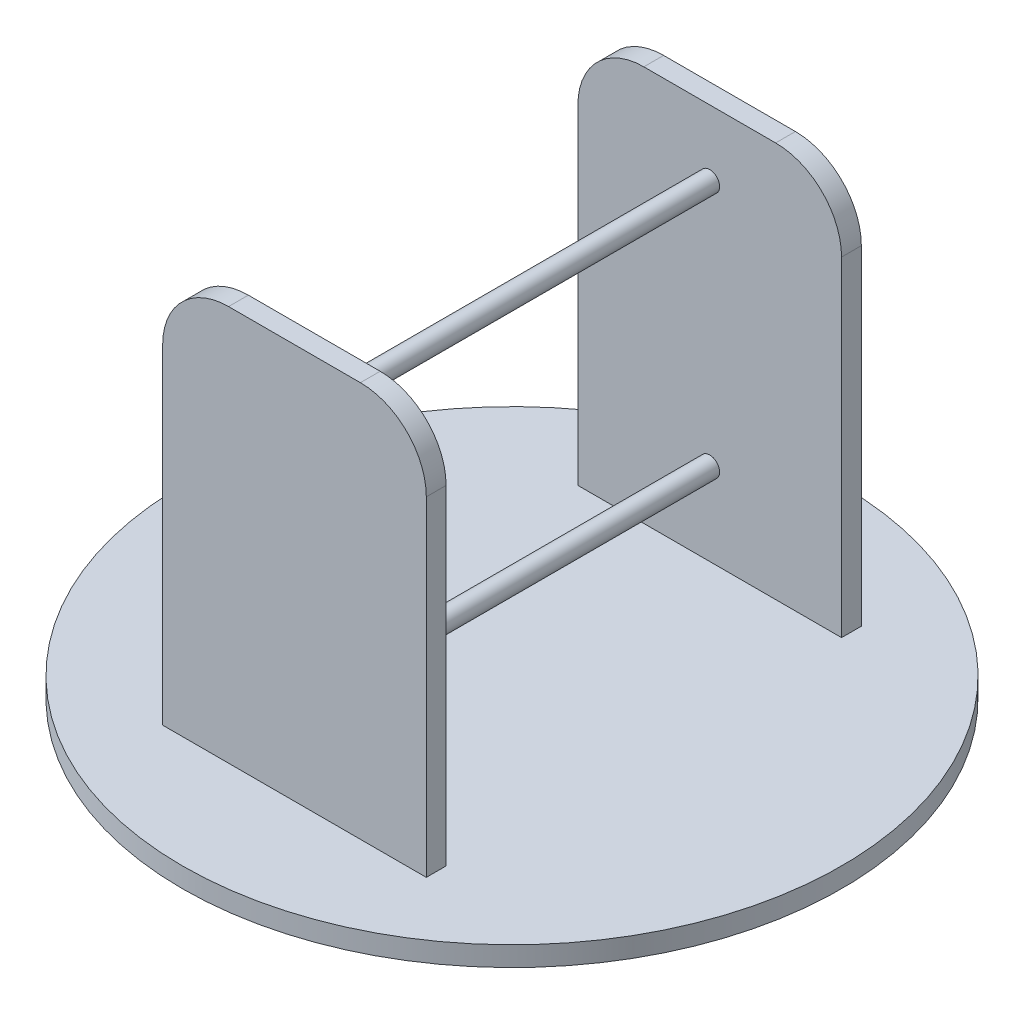
ISO-10303-21;
HEADER;
FILE_DESCRIPTION(('STEP AP214'),'2;1');
FILE_NAME('part.step','',(''),(''),'','','');
FILE_SCHEMA(('AUTOMOTIVE_DESIGN { 1 0 10303 214 1 1 1 1 }'));
ENDSEC;
DATA;
#1=APPLICATION_CONTEXT('core data for automotive mechanical design processes');
#2=APPLICATION_PROTOCOL_DEFINITION('international standard','automotive_design',2000,#1);
#3=PRODUCT_CONTEXT('',#1,'mechanical');
#4=PRODUCT('Part','Part','',(#3));
#5=PRODUCT_RELATED_PRODUCT_CATEGORY('part','',(#4));
#6=PRODUCT_DEFINITION_FORMATION('','',#4);
#7=PRODUCT_DEFINITION_CONTEXT('part definition',#1,'design');
#8=PRODUCT_DEFINITION('design','',#6,#7);
#9=PRODUCT_DEFINITION_SHAPE('','',#8);
#10=(LENGTH_UNIT() NAMED_UNIT(*) SI_UNIT(.MILLI.,.METRE.));
#11=(NAMED_UNIT(*) PLANE_ANGLE_UNIT() SI_UNIT($,.RADIAN.));
#12=(NAMED_UNIT(*) SI_UNIT($,.STERADIAN.) SOLID_ANGLE_UNIT());
#13=UNCERTAINTY_MEASURE_WITH_UNIT(LENGTH_MEASURE(1.E-05),#10,'distance_accuracy_value','');
#14=(GEOMETRIC_REPRESENTATION_CONTEXT(3) GLOBAL_UNCERTAINTY_ASSIGNED_CONTEXT((#13)) GLOBAL_UNIT_ASSIGNED_CONTEXT((#10,
#11,#12)) REPRESENTATION_CONTEXT('',''));
#15=CARTESIAN_POINT('',(0.,0.,0.));
#16=DIRECTION('',(0.,0.,1.));
#17=DIRECTION('',(1.,0.,0.));
#18=AXIS2_PLACEMENT_3D('',#15,#16,#17);
#19=CARTESIAN_POINT('',(0.,3.,0.));
#20=DIRECTION('',(0.,1.,0.));
#21=DIRECTION('',(0.,0.,1.));
#22=AXIS2_PLACEMENT_3D('',#19,#20,#21);
#23=PLANE('',#22);
#24=CARTESIAN_POINT('',(0.,3.,0.));
#25=DIRECTION('',(0.,1.,0.));
#26=DIRECTION('',(0.,0.,1.));
#27=AXIS2_PLACEMENT_3D('',#24,#25,#26);
#28=CIRCLE('',#27,50.);
#29=CARTESIAN_POINT('',(0.,3.,50.));
#30=VERTEX_POINT('',#29);
#31=EDGE_CURVE('E184',#30,#30,#28,.T.);
#32=ORIENTED_EDGE('',*,*,#31,.T.);
#33=EDGE_LOOP('',(#32));
#34=FACE_BOUND('',#33,.T.);
#35=DIRECTION('',(1.,0.,0.));
#36=VECTOR('',#35,1.);
#37=CARTESIAN_POINT('',(-20.,3.,33.));
#38=LINE('',#37,#36);
#39=CARTESIAN_POINT('',(-20.,3.,33.));
#40=VERTEX_POINT('',#39);
#41=CARTESIAN_POINT('',(20.,3.,33.));
#42=VERTEX_POINT('',#41);
#43=EDGE_CURVE('E168',#40,#42,#38,.T.);
#44=ORIENTED_EDGE('',*,*,#43,.F.);
#45=DIRECTION('',(0.,0.,1.));
#46=VECTOR('',#45,1.);
#47=CARTESIAN_POINT('',(-20.,3.,33.));
#48=LINE('',#47,#46);
#49=CARTESIAN_POINT('',(-20.,3.,30.));
#50=VERTEX_POINT('',#49);
#51=EDGE_CURVE('E132',#50,#40,#48,.T.);
#52=ORIENTED_EDGE('',*,*,#51,.F.);
#53=DIRECTION('',(-1.,0.,0.));
#54=VECTOR('',#53,1.);
#55=CARTESIAN_POINT('',(-20.,3.,30.));
#56=LINE('',#55,#54);
#57=CARTESIAN_POINT('',(20.,3.,30.));
#58=VERTEX_POINT('',#57);
#59=EDGE_CURVE('E162',#58,#50,#56,.T.);
#60=ORIENTED_EDGE('',*,*,#59,.F.);
#61=DIRECTION('',(0.,0.,-1.));
#62=VECTOR('',#61,1.);
#63=CARTESIAN_POINT('',(20.,3.,33.));
#64=LINE('',#63,#62);
#65=EDGE_CURVE('E171',#42,#58,#64,.T.);
#66=ORIENTED_EDGE('',*,*,#65,.F.);
#67=EDGE_LOOP('',(#44,#52,#60,#66));
#68=FACE_BOUND('',#67,.T.);
#69=DIRECTION('',(1.,0.,0.));
#70=VECTOR('',#69,1.);
#71=CARTESIAN_POINT('',(-20.,3.,-30.));
#72=LINE('',#71,#70);
#73=CARTESIAN_POINT('',(-20.,3.,-30.));
#74=VERTEX_POINT('',#73);
#75=CARTESIAN_POINT('',(20.,3.,-30.));
#76=VERTEX_POINT('',#75);
#77=EDGE_CURVE('E129',#74,#76,#72,.T.);
#78=ORIENTED_EDGE('',*,*,#77,.F.);
#79=DIRECTION('',(0.,0.,1.));
#80=VECTOR('',#79,1.);
#81=CARTESIAN_POINT('',(-20.,3.,-30.));
#82=LINE('',#81,#80);
#83=CARTESIAN_POINT('',(-20.,3.,-33.));
#84=VERTEX_POINT('',#83);
#85=EDGE_CURVE('E136',#84,#74,#82,.T.);
#86=ORIENTED_EDGE('',*,*,#85,.F.);
#87=DIRECTION('',(-1.,0.,0.));
#88=VECTOR('',#87,1.);
#89=CARTESIAN_POINT('',(-20.,3.,-33.));
#90=LINE('',#89,#88);
#91=CARTESIAN_POINT('',(20.,3.,-33.));
#92=VERTEX_POINT('',#91);
#93=EDGE_CURVE('E147',#92,#84,#90,.T.);
#94=ORIENTED_EDGE('',*,*,#93,.F.);
#95=DIRECTION('',(0.,0.,-1.));
#96=VECTOR('',#95,1.);
#97=CARTESIAN_POINT('',(20.,3.,-30.));
#98=LINE('',#97,#96);
#99=EDGE_CURVE('E145',#76,#92,#98,.T.);
#100=ORIENTED_EDGE('',*,*,#99,.F.);
#101=EDGE_LOOP('',(#78,#86,#94,#100));
#102=FACE_BOUND('',#101,.T.);
#103=ADVANCED_FACE('F35',(#34,#68,#102),#23,.T.);
#104=CARTESIAN_POINT('',(0.,3.,0.));
#105=DIRECTION('',(0.,-1.,0.));
#106=DIRECTION('',(0.,0.,-1.));
#107=AXIS2_PLACEMENT_3D('',#104,#105,#106);
#108=CYLINDRICAL_SURFACE('',#107,50.);
#109=ORIENTED_EDGE('',*,*,#31,.F.);
#110=EDGE_LOOP('',(#109));
#111=FACE_BOUND('',#110,.T.);
#112=CARTESIAN_POINT('',(0.,0.,0.));
#113=DIRECTION('',(0.,1.,0.));
#114=DIRECTION('',(0.,0.,1.));
#115=AXIS2_PLACEMENT_3D('',#112,#113,#114);
#116=CIRCLE('',#115,50.);
#117=CARTESIAN_POINT('',(0.,0.,50.));
#118=VERTEX_POINT('',#117);
#119=EDGE_CURVE('E183',#118,#118,#116,.T.);
#120=ORIENTED_EDGE('',*,*,#119,.T.);
#121=EDGE_LOOP('',(#120));
#122=FACE_BOUND('',#121,.T.);
#123=ADVANCED_FACE('F300',(#111,#122),#108,.T.);
#124=CARTESIAN_POINT('',(0.,0.,0.));
#125=DIRECTION('',(0.,1.,0.));
#126=DIRECTION('',(0.,0.,1.));
#127=AXIS2_PLACEMENT_3D('',#124,#125,#126);
#128=PLANE('',#127);
#129=ORIENTED_EDGE('',*,*,#119,.F.);
#130=EDGE_LOOP('',(#129));
#131=FACE_BOUND('',#130,.T.);
#132=ADVANCED_FACE('F293',(#131),#128,.F.);
#133=CARTESIAN_POINT('',(-20.,63.,33.));
#134=DIRECTION('',(1.,0.,0.));
#135=DIRECTION('',(0.,0.,-1.));
#136=AXIS2_PLACEMENT_3D('',#133,#134,#135);
#137=PLANE('',#136);
#138=DIRECTION('',(0.,-1.,0.));
#139=VECTOR('',#138,1.);
#140=CARTESIAN_POINT('',(-20.,63.,33.));
#141=LINE('',#140,#139);
#142=CARTESIAN_POINT('',(-20.,53.,33.));
#143=VERTEX_POINT('',#142);
#144=EDGE_CURVE('E181',#143,#40,#141,.T.);
#145=ORIENTED_EDGE('',*,*,#144,.F.);
#146=DIRECTION('',(0.,0.,1.));
#147=VECTOR('',#146,1.);
#148=CARTESIAN_POINT('',(-20.,53.,33.));
#149=LINE('',#148,#147);
#150=CARTESIAN_POINT('',(-20.,53.,30.));
#151=VERTEX_POINT('',#150);
#152=EDGE_CURVE('E199',#143,#151,#149,.F.);
#153=ORIENTED_EDGE('',*,*,#152,.T.);
#154=DIRECTION('',(0.,-1.,0.));
#155=VECTOR('',#154,1.);
#156=CARTESIAN_POINT('',(-20.,63.,30.));
#157=LINE('',#156,#155);
#158=EDGE_CURVE('E165',#151,#50,#157,.T.);
#159=ORIENTED_EDGE('',*,*,#158,.T.);
#160=ORIENTED_EDGE('',*,*,#51,.T.);
#161=EDGE_LOOP('',(#145,#153,#159,#160));
#162=FACE_BOUND('',#161,.T.);
#163=ADVANCED_FACE('F291',(#162),#137,.F.);
#164=CARTESIAN_POINT('',(-20.,63.,33.));
#165=DIRECTION('',(0.,0.,-1.));
#166=DIRECTION('',(-1.,0.,0.));
#167=AXIS2_PLACEMENT_3D('',#164,#165,#166);
#168=PLANE('',#167);
#169=DIRECTION('',(1.,0.,0.));
#170=VECTOR('',#169,1.);
#171=CARTESIAN_POINT('',(-20.,63.,33.));
#172=LINE('',#171,#170);
#173=CARTESIAN_POINT('',(-10.,63.,33.));
#174=VERTEX_POINT('',#173);
#175=CARTESIAN_POINT('',(10.,63.,33.));
#176=VERTEX_POINT('',#175);
#177=EDGE_CURVE('E158',#174,#176,#172,.T.);
#178=ORIENTED_EDGE('',*,*,#177,.F.);
#179=CARTESIAN_POINT('',(-10.,53.,33.));
#180=DIRECTION('',(0.,0.,-1.));
#181=DIRECTION('',(-1.,0.,0.));
#182=AXIS2_PLACEMENT_3D('',#179,#180,#181);
#183=CIRCLE('',#182,10.);
#184=EDGE_CURVE('E197',#174,#143,#183,.F.);
#185=ORIENTED_EDGE('',*,*,#184,.T.);
#186=ORIENTED_EDGE('',*,*,#144,.T.);
#187=ORIENTED_EDGE('',*,*,#43,.T.);
#188=DIRECTION('',(0.,-1.,0.));
#189=VECTOR('',#188,1.);
#190=CARTESIAN_POINT('',(20.,63.,33.));
#191=LINE('',#190,#189);
#192=CARTESIAN_POINT('',(20.,53.,33.));
#193=VERTEX_POINT('',#192);
#194=EDGE_CURVE('E179',#193,#42,#191,.T.);
#195=ORIENTED_EDGE('',*,*,#194,.F.);
#196=CARTESIAN_POINT('',(10.,53.,33.));
#197=DIRECTION('',(0.,0.,-1.));
#198=DIRECTION('',(-1.,0.,0.));
#199=AXIS2_PLACEMENT_3D('',#196,#197,#198);
#200=CIRCLE('',#199,10.);
#201=EDGE_CURVE('E195',#193,#176,#200,.F.);
#202=ORIENTED_EDGE('',*,*,#201,.T.);
#203=EDGE_LOOP('',(#178,#185,#186,#187,#195,#202));
#204=FACE_BOUND('',#203,.T.);
#205=ADVANCED_FACE('F280',(#204),#168,.F.);
#206=CARTESIAN_POINT('',(20.,63.,33.));
#207=DIRECTION('',(-1.,0.,0.));
#208=DIRECTION('',(0.,0.,1.));
#209=AXIS2_PLACEMENT_3D('',#206,#207,#208);
#210=PLANE('',#209);
#211=DIRECTION('',(0.,-1.,0.));
#212=VECTOR('',#211,1.);
#213=CARTESIAN_POINT('',(20.,63.,30.));
#214=LINE('',#213,#212);
#215=CARTESIAN_POINT('',(20.,53.,30.));
#216=VERTEX_POINT('',#215);
#217=EDGE_CURVE('E177',#216,#58,#214,.T.);
#218=ORIENTED_EDGE('',*,*,#217,.F.);
#219=DIRECTION('',(0.,0.,-1.));
#220=VECTOR('',#219,1.);
#221=CARTESIAN_POINT('',(20.,53.,33.));
#222=LINE('',#221,#220);
#223=EDGE_CURVE('E11',#216,#193,#222,.F.);
#224=ORIENTED_EDGE('',*,*,#223,.T.);
#225=ORIENTED_EDGE('',*,*,#194,.T.);
#226=ORIENTED_EDGE('',*,*,#65,.T.);
#227=EDGE_LOOP('',(#218,#224,#225,#226));
#228=FACE_BOUND('',#227,.T.);
#229=ADVANCED_FACE('F263',(#228),#210,.F.);
#230=CARTESIAN_POINT('',(-20.,63.,30.));
#231=DIRECTION('',(0.,0.,1.));
#232=DIRECTION('',(1.,0.,0.));
#233=AXIS2_PLACEMENT_3D('',#230,#231,#232);
#234=PLANE('',#233);
#235=CARTESIAN_POINT('',(0.,15.5,30.));
#236=DIRECTION('',(0.,0.,1.));
#237=DIRECTION('',(1.,0.,0.));
#238=AXIS2_PLACEMENT_3D('',#235,#236,#237);
#239=CIRCLE('',#238,1.5);
#240=CARTESIAN_POINT('',(1.5,15.5,30.));
#241=VERTEX_POINT('',#240);
#242=EDGE_CURVE('E238',#241,#241,#239,.T.);
#243=ORIENTED_EDGE('',*,*,#242,.T.);
#244=EDGE_LOOP('',(#243));
#245=FACE_BOUND('',#244,.T.);
#246=CARTESIAN_POINT('',(0.,53.,30.));
#247=DIRECTION('',(0.,0.,1.));
#248=DIRECTION('',(1.,0.,0.));
#249=AXIS2_PLACEMENT_3D('',#246,#247,#248);
#250=CIRCLE('',#249,1.5);
#251=CARTESIAN_POINT('',(1.5,53.,30.));
#252=VERTEX_POINT('',#251);
#253=EDGE_CURVE('E142',#252,#252,#250,.T.);
#254=ORIENTED_EDGE('',*,*,#253,.T.);
#255=EDGE_LOOP('',(#254));
#256=FACE_BOUND('',#255,.T.);
#257=ORIENTED_EDGE('',*,*,#158,.F.);
#258=CARTESIAN_POINT('',(-10.,53.,30.));
#259=DIRECTION('',(0.,0.,1.));
#260=DIRECTION('',(1.,0.,0.));
#261=AXIS2_PLACEMENT_3D('',#258,#259,#260);
#262=CIRCLE('',#261,10.);
#263=CARTESIAN_POINT('',(-10.,63.,30.));
#264=VERTEX_POINT('',#263);
#265=EDGE_CURVE('E203',#151,#264,#262,.F.);
#266=ORIENTED_EDGE('',*,*,#265,.T.);
#267=DIRECTION('',(-1.,0.,0.));
#268=VECTOR('',#267,1.);
#269=CARTESIAN_POINT('',(-20.,63.,30.));
#270=LINE('',#269,#268);
#271=CARTESIAN_POINT('',(10.,63.,30.));
#272=VERTEX_POINT('',#271);
#273=EDGE_CURVE('E161',#272,#264,#270,.T.);
#274=ORIENTED_EDGE('',*,*,#273,.F.);
#275=CARTESIAN_POINT('',(10.,53.,30.));
#276=DIRECTION('',(0.,0.,1.));
#277=DIRECTION('',(1.,0.,0.));
#278=AXIS2_PLACEMENT_3D('',#275,#276,#277);
#279=CIRCLE('',#278,10.);
#280=EDGE_CURVE('E201',#272,#216,#279,.F.);
#281=ORIENTED_EDGE('',*,*,#280,.T.);
#282=ORIENTED_EDGE('',*,*,#217,.T.);
#283=ORIENTED_EDGE('',*,*,#59,.T.);
#284=EDGE_LOOP('',(#257,#266,#274,#281,#282,#283));
#285=FACE_BOUND('',#284,.T.);
#286=ADVANCED_FACE('F259',(#245,#256,#285),#234,.F.);
#287=CARTESIAN_POINT('',(0.,63.,0.));
#288=DIRECTION('',(0.,-1.,0.));
#289=DIRECTION('',(0.,0.,-1.));
#290=AXIS2_PLACEMENT_3D('',#287,#288,#289);
#291=PLANE('',#290);
#292=ORIENTED_EDGE('',*,*,#273,.T.);
#293=DIRECTION('',(0.,0.,1.));
#294=VECTOR('',#293,1.);
#295=CARTESIAN_POINT('',(-10.,63.,0.));
#296=LINE('',#295,#294);
#297=EDGE_CURVE('E192',#264,#174,#296,.T.);
#298=ORIENTED_EDGE('',*,*,#297,.T.);
#299=ORIENTED_EDGE('',*,*,#177,.T.);
#300=DIRECTION('',(0.,0.,-1.));
#301=VECTOR('',#300,1.);
#302=CARTESIAN_POINT('',(10.,63.,0.));
#303=LINE('',#302,#301);
#304=EDGE_CURVE('E187',#176,#272,#303,.T.);
#305=ORIENTED_EDGE('',*,*,#304,.T.);
#306=EDGE_LOOP('',(#292,#298,#299,#305));
#307=FACE_BOUND('',#306,.T.);
#308=ADVANCED_FACE('F262',(#307),#291,.F.);
#309=CARTESIAN_POINT('',(-20.,63.,-30.));
#310=DIRECTION('',(1.,0.,0.));
#311=DIRECTION('',(0.,0.,-1.));
#312=AXIS2_PLACEMENT_3D('',#309,#310,#311);
#313=PLANE('',#312);
#314=DIRECTION('',(0.,-1.,0.));
#315=VECTOR('',#314,1.);
#316=CARTESIAN_POINT('',(-20.,63.,-30.));
#317=LINE('',#316,#315);
#318=CARTESIAN_POINT('',(-20.,53.,-30.));
#319=VERTEX_POINT('',#318);
#320=EDGE_CURVE('E123',#319,#74,#317,.T.);
#321=ORIENTED_EDGE('',*,*,#320,.F.);
#322=DIRECTION('',(0.,0.,1.));
#323=VECTOR('',#322,1.);
#324=CARTESIAN_POINT('',(-20.,53.,-30.));
#325=LINE('',#324,#323);
#326=CARTESIAN_POINT('',(-20.,53.,-33.));
#327=VERTEX_POINT('',#326);
#328=EDGE_CURVE('E58',#319,#327,#325,.F.);
#329=ORIENTED_EDGE('',*,*,#328,.T.);
#330=DIRECTION('',(0.,-1.,0.));
#331=VECTOR('',#330,1.);
#332=CARTESIAN_POINT('',(-20.,63.,-33.));
#333=LINE('',#332,#331);
#334=EDGE_CURVE('E138',#327,#84,#333,.T.);
#335=ORIENTED_EDGE('',*,*,#334,.T.);
#336=ORIENTED_EDGE('',*,*,#85,.T.);
#337=EDGE_LOOP('',(#321,#329,#335,#336));
#338=FACE_BOUND('',#337,.T.);
#339=ADVANCED_FACE('F137',(#338),#313,.F.);
#340=CARTESIAN_POINT('',(-20.,63.,-30.));
#341=DIRECTION('',(0.,0.,-1.));
#342=DIRECTION('',(-1.,0.,0.));
#343=AXIS2_PLACEMENT_3D('',#340,#341,#342);
#344=PLANE('',#343);
#345=CARTESIAN_POINT('',(0.,15.5,-30.));
#346=DIRECTION('',(0.,0.,-1.));
#347=DIRECTION('',(-1.,0.,0.));
#348=AXIS2_PLACEMENT_3D('',#345,#346,#347);
#349=CIRCLE('',#348,1.5);
#350=CARTESIAN_POINT('',(-1.5,15.5,-30.));
#351=VERTEX_POINT('',#350);
#352=EDGE_CURVE('E241',#351,#351,#349,.F.);
#353=ORIENTED_EDGE('',*,*,#352,.F.);
#354=EDGE_LOOP('',(#353));
#355=FACE_BOUND('',#354,.T.);
#356=CARTESIAN_POINT('',(0.,53.,-30.));
#357=DIRECTION('',(0.,0.,-1.));
#358=DIRECTION('',(-1.,0.,0.));
#359=AXIS2_PLACEMENT_3D('',#356,#357,#358);
#360=CIRCLE('',#359,1.5);
#361=CARTESIAN_POINT('',(-1.5,53.,-30.));
#362=VERTEX_POINT('',#361);
#363=EDGE_CURVE('E235',#362,#362,#360,.F.);
#364=ORIENTED_EDGE('',*,*,#363,.F.);
#365=EDGE_LOOP('',(#364));
#366=FACE_BOUND('',#365,.T.);
#367=DIRECTION('',(1.,0.,0.));
#368=VECTOR('',#367,1.);
#369=CARTESIAN_POINT('',(-20.,63.,-30.));
#370=LINE('',#369,#368);
#371=CARTESIAN_POINT('',(-10.,63.,-30.));
#372=VERTEX_POINT('',#371);
#373=CARTESIAN_POINT('',(10.,63.,-30.));
#374=VERTEX_POINT('',#373);
#375=EDGE_CURVE('E152',#372,#374,#370,.T.);
#376=ORIENTED_EDGE('',*,*,#375,.F.);
#377=CARTESIAN_POINT('',(-10.,53.,-30.));
#378=DIRECTION('',(0.,0.,-1.));
#379=DIRECTION('',(-1.,0.,0.));
#380=AXIS2_PLACEMENT_3D('',#377,#378,#379);
#381=CIRCLE('',#380,10.);
#382=EDGE_CURVE('E131',#372,#319,#381,.F.);
#383=ORIENTED_EDGE('',*,*,#382,.T.);
#384=ORIENTED_EDGE('',*,*,#320,.T.);
#385=ORIENTED_EDGE('',*,*,#77,.T.);
#386=DIRECTION('',(0.,-1.,0.));
#387=VECTOR('',#386,1.);
#388=CARTESIAN_POINT('',(20.,63.,-30.));
#389=LINE('',#388,#387);
#390=CARTESIAN_POINT('',(20.,53.,-30.));
#391=VERTEX_POINT('',#390);
#392=EDGE_CURVE('E133',#391,#76,#389,.T.);
#393=ORIENTED_EDGE('',*,*,#392,.F.);
#394=CARTESIAN_POINT('',(10.,53.,-30.));
#395=DIRECTION('',(0.,0.,-1.));
#396=DIRECTION('',(-1.,0.,0.));
#397=AXIS2_PLACEMENT_3D('',#394,#395,#396);
#398=CIRCLE('',#397,10.);
#399=EDGE_CURVE('E211',#391,#374,#398,.F.);
#400=ORIENTED_EDGE('',*,*,#399,.T.);
#401=EDGE_LOOP('',(#376,#383,#384,#385,#393,#400));
#402=FACE_BOUND('',#401,.T.);
#403=ADVANCED_FACE('F126',(#355,#366,#402),#344,.F.);
#404=CARTESIAN_POINT('',(20.,63.,-30.));
#405=DIRECTION('',(-1.,0.,0.));
#406=DIRECTION('',(0.,0.,1.));
#407=AXIS2_PLACEMENT_3D('',#404,#405,#406);
#408=PLANE('',#407);
#409=DIRECTION('',(0.,-1.,0.));
#410=VECTOR('',#409,1.);
#411=CARTESIAN_POINT('',(20.,63.,-33.));
#412=LINE('',#411,#410);
#413=CARTESIAN_POINT('',(20.,53.,-33.));
#414=VERTEX_POINT('',#413);
#415=EDGE_CURVE('E154',#414,#92,#412,.T.);
#416=ORIENTED_EDGE('',*,*,#415,.F.);
#417=DIRECTION('',(0.,0.,-1.));
#418=VECTOR('',#417,1.);
#419=CARTESIAN_POINT('',(20.,53.,-30.));
#420=LINE('',#419,#418);
#421=EDGE_CURVE('E43',#414,#391,#420,.F.);
#422=ORIENTED_EDGE('',*,*,#421,.T.);
#423=ORIENTED_EDGE('',*,*,#392,.T.);
#424=ORIENTED_EDGE('',*,*,#99,.T.);
#425=EDGE_LOOP('',(#416,#422,#423,#424));
#426=FACE_BOUND('',#425,.T.);
#427=ADVANCED_FACE('F219',(#426),#408,.F.);
#428=CARTESIAN_POINT('',(-20.,63.,-33.));
#429=DIRECTION('',(0.,0.,1.));
#430=DIRECTION('',(1.,0.,0.));
#431=AXIS2_PLACEMENT_3D('',#428,#429,#430);
#432=PLANE('',#431);
#433=ORIENTED_EDGE('',*,*,#334,.F.);
#434=CARTESIAN_POINT('',(-10.,53.,-33.));
#435=DIRECTION('',(0.,0.,1.));
#436=DIRECTION('',(1.,0.,0.));
#437=AXIS2_PLACEMENT_3D('',#434,#435,#436);
#438=CIRCLE('',#437,10.);
#439=CARTESIAN_POINT('',(-10.,63.,-33.));
#440=VERTEX_POINT('',#439);
#441=EDGE_CURVE('E216',#327,#440,#438,.F.);
#442=ORIENTED_EDGE('',*,*,#441,.T.);
#443=DIRECTION('',(-1.,0.,0.));
#444=VECTOR('',#443,1.);
#445=CARTESIAN_POINT('',(-20.,63.,-33.));
#446=LINE('',#445,#444);
#447=CARTESIAN_POINT('',(10.,63.,-33.));
#448=VERTEX_POINT('',#447);
#449=EDGE_CURVE('E155',#448,#440,#446,.T.);
#450=ORIENTED_EDGE('',*,*,#449,.F.);
#451=CARTESIAN_POINT('',(10.,53.,-33.));
#452=DIRECTION('',(0.,0.,1.));
#453=DIRECTION('',(1.,0.,0.));
#454=AXIS2_PLACEMENT_3D('',#451,#452,#453);
#455=CIRCLE('',#454,10.);
#456=EDGE_CURVE('E50',#448,#414,#455,.F.);
#457=ORIENTED_EDGE('',*,*,#456,.T.);
#458=ORIENTED_EDGE('',*,*,#415,.T.);
#459=ORIENTED_EDGE('',*,*,#93,.T.);
#460=EDGE_LOOP('',(#433,#442,#450,#457,#458,#459));
#461=FACE_BOUND('',#460,.T.);
#462=ADVANCED_FACE('F229',(#461),#432,.F.);
#463=CARTESIAN_POINT('',(0.,63.,0.));
#464=DIRECTION('',(0.,-1.,0.));
#465=DIRECTION('',(0.,0.,-1.));
#466=AXIS2_PLACEMENT_3D('',#463,#464,#465);
#467=PLANE('',#466);
#468=ORIENTED_EDGE('',*,*,#449,.T.);
#469=DIRECTION('',(0.,0.,1.));
#470=VECTOR('',#469,1.);
#471=CARTESIAN_POINT('',(-10.,63.,0.));
#472=LINE('',#471,#470);
#473=EDGE_CURVE('E208',#440,#372,#472,.T.);
#474=ORIENTED_EDGE('',*,*,#473,.T.);
#475=ORIENTED_EDGE('',*,*,#375,.T.);
#476=DIRECTION('',(0.,0.,-1.));
#477=VECTOR('',#476,1.);
#478=CARTESIAN_POINT('',(10.,63.,0.));
#479=LINE('',#478,#477);
#480=EDGE_CURVE('E205',#374,#448,#479,.T.);
#481=ORIENTED_EDGE('',*,*,#480,.T.);
#482=EDGE_LOOP('',(#468,#474,#475,#481));
#483=FACE_BOUND('',#482,.T.);
#484=ADVANCED_FACE('F227',(#483),#467,.F.);
#485=CARTESIAN_POINT('',(0.,53.,-34.2426406871193));
#486=DIRECTION('',(0.,0.,1.));
#487=DIRECTION('',(1.,0.,0.));
#488=AXIS2_PLACEMENT_3D('',#485,#486,#487);
#489=CYLINDRICAL_SURFACE('',#488,1.5);
#490=ORIENTED_EDGE('',*,*,#363,.T.);
#491=EDGE_LOOP('',(#490));
#492=FACE_BOUND('',#491,.T.);
#493=ORIENTED_EDGE('',*,*,#253,.F.);
#494=EDGE_LOOP('',(#493));
#495=FACE_BOUND('',#494,.T.);
#496=ADVANCED_FACE('F253',(#492,#495),#489,.T.);
#497=CARTESIAN_POINT('',(0.,15.5,-34.2426406871193));
#498=DIRECTION('',(0.,0.,1.));
#499=DIRECTION('',(1.,0.,0.));
#500=AXIS2_PLACEMENT_3D('',#497,#498,#499);
#501=CYLINDRICAL_SURFACE('',#500,1.5);
#502=ORIENTED_EDGE('',*,*,#352,.T.);
#503=EDGE_LOOP('',(#502));
#504=FACE_BOUND('',#503,.T.);
#505=ORIENTED_EDGE('',*,*,#242,.F.);
#506=EDGE_LOOP('',(#505));
#507=FACE_BOUND('',#506,.T.);
#508=ADVANCED_FACE('F245',(#504,#507),#501,.T.);
#509=CARTESIAN_POINT('',(-10.,53.,0.));
#510=DIRECTION('',(0.,0.,1.));
#511=DIRECTION('',(1.,0.,0.));
#512=AXIS2_PLACEMENT_3D('',#509,#510,#511);
#513=CYLINDRICAL_SURFACE('',#512,10.);
#514=ORIENTED_EDGE('',*,*,#265,.F.);
#515=ORIENTED_EDGE('',*,*,#152,.F.);
#516=ORIENTED_EDGE('',*,*,#184,.F.);
#517=ORIENTED_EDGE('',*,*,#297,.F.);
#518=EDGE_LOOP('',(#514,#515,#516,#517));
#519=FACE_BOUND('',#518,.T.);
#520=ADVANCED_FACE('F275',(#519),#513,.T.);
#521=CARTESIAN_POINT('',(-10.,53.,0.));
#522=DIRECTION('',(0.,0.,1.));
#523=DIRECTION('',(1.,0.,0.));
#524=AXIS2_PLACEMENT_3D('',#521,#522,#523);
#525=CYLINDRICAL_SURFACE('',#524,10.);
#526=ORIENTED_EDGE('',*,*,#441,.F.);
#527=ORIENTED_EDGE('',*,*,#328,.F.);
#528=ORIENTED_EDGE('',*,*,#382,.F.);
#529=ORIENTED_EDGE('',*,*,#473,.F.);
#530=EDGE_LOOP('',(#526,#527,#528,#529));
#531=FACE_BOUND('',#530,.T.);
#532=ADVANCED_FACE('F314',(#531),#525,.T.);
#533=CARTESIAN_POINT('',(10.,53.,0.));
#534=DIRECTION('',(0.,0.,-1.));
#535=DIRECTION('',(-1.,0.,0.));
#536=AXIS2_PLACEMENT_3D('',#533,#534,#535);
#537=CYLINDRICAL_SURFACE('',#536,10.);
#538=ORIENTED_EDGE('',*,*,#399,.F.);
#539=ORIENTED_EDGE('',*,*,#421,.F.);
#540=ORIENTED_EDGE('',*,*,#456,.F.);
#541=ORIENTED_EDGE('',*,*,#480,.F.);
#542=EDGE_LOOP('',(#538,#539,#540,#541));
#543=FACE_BOUND('',#542,.T.);
#544=ADVANCED_FACE('F224',(#543),#537,.T.);
#545=CARTESIAN_POINT('',(10.,53.,0.));
#546=DIRECTION('',(0.,0.,-1.));
#547=DIRECTION('',(-1.,0.,0.));
#548=AXIS2_PLACEMENT_3D('',#545,#546,#547);
#549=CYLINDRICAL_SURFACE('',#548,10.);
#550=ORIENTED_EDGE('',*,*,#201,.F.);
#551=ORIENTED_EDGE('',*,*,#223,.F.);
#552=ORIENTED_EDGE('',*,*,#280,.F.);
#553=ORIENTED_EDGE('',*,*,#304,.F.);
#554=EDGE_LOOP('',(#550,#551,#552,#553));
#555=FACE_BOUND('',#554,.T.);
#556=ADVANCED_FACE('F37',(#555),#549,.T.);
#557=CLOSED_SHELL('',(#103,#123,#132,#163,#205,#229,#286,#308,#339,#403,#427,#462,#484,#496,
#508,#520,#532,#544,#556));
#558=MANIFOLD_SOLID_BREP('B2',#557);
#559=ADVANCED_BREP_SHAPE_REPRESENTATION('',(#18,#558),#14);
#560=SHAPE_DEFINITION_REPRESENTATION(#9,#559);
ENDSEC;
END-ISO-10303-21;
